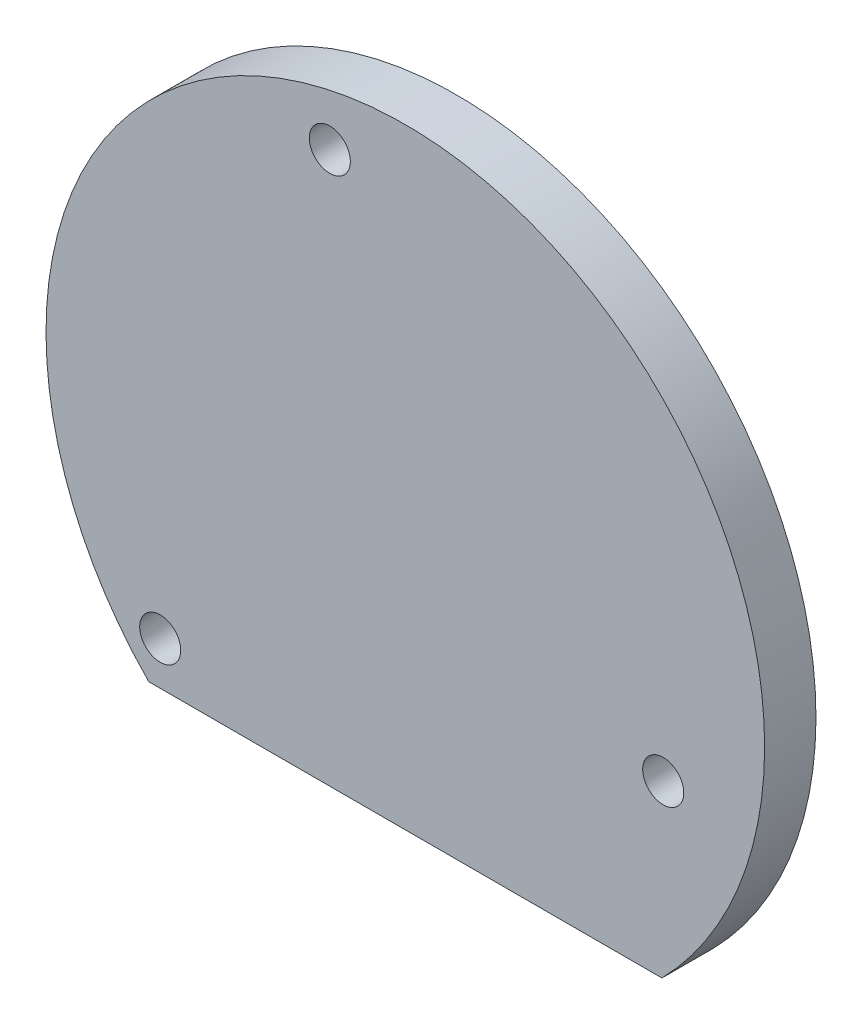
ISO-10303-21;
HEADER;
FILE_DESCRIPTION(('STEP AP214'),'2;1');
FILE_NAME('part.step','',(''),(''),'','','');
FILE_SCHEMA(('AUTOMOTIVE_DESIGN { 1 0 10303 214 1 1 1 1 }'));
ENDSEC;
DATA;
#1=APPLICATION_CONTEXT('core data for automotive mechanical design processes');
#2=APPLICATION_PROTOCOL_DEFINITION('international standard','automotive_design',2000,#1);
#3=PRODUCT_CONTEXT('',#1,'mechanical');
#4=PRODUCT('Part','Part','',(#3));
#5=PRODUCT_RELATED_PRODUCT_CATEGORY('part','',(#4));
#6=PRODUCT_DEFINITION_FORMATION('','',#4);
#7=PRODUCT_DEFINITION_CONTEXT('part definition',#1,'design');
#8=PRODUCT_DEFINITION('design','',#6,#7);
#9=PRODUCT_DEFINITION_SHAPE('','',#8);
#10=(LENGTH_UNIT() NAMED_UNIT(*) SI_UNIT(.MILLI.,.METRE.));
#11=(NAMED_UNIT(*) PLANE_ANGLE_UNIT() SI_UNIT($,.RADIAN.));
#12=(NAMED_UNIT(*) SI_UNIT($,.STERADIAN.) SOLID_ANGLE_UNIT());
#13=UNCERTAINTY_MEASURE_WITH_UNIT(LENGTH_MEASURE(1.E-05),#10,'distance_accuracy_value','');
#14=(GEOMETRIC_REPRESENTATION_CONTEXT(3) GLOBAL_UNCERTAINTY_ASSIGNED_CONTEXT((#13)) GLOBAL_UNIT_ASSIGNED_CONTEXT((#10,
#11,#12)) REPRESENTATION_CONTEXT('',''));
#15=CARTESIAN_POINT('',(0.,0.,0.));
#16=DIRECTION('',(0.,0.,1.));
#17=DIRECTION('',(1.,0.,0.));
#18=AXIS2_PLACEMENT_3D('',#15,#16,#17);
#19=CARTESIAN_POINT('',(0.,0.,5.08));
#20=DIRECTION('',(0.,0.,-1.));
#21=DIRECTION('',(-1.,0.,0.));
#22=AXIS2_PLACEMENT_3D('',#19,#20,#21);
#23=CYLINDRICAL_SURFACE('',#22,35.56);
#24=CARTESIAN_POINT('',(0.,0.,5.08));
#25=DIRECTION('',(0.,0.,1.));
#26=DIRECTION('',(1.,0.,0.));
#27=AXIS2_PLACEMENT_3D('',#24,#25,#26);
#28=CIRCLE('',#27,35.56);
#29=CARTESIAN_POINT('',(25.3949194918984,-24.892,5.08));
#30=VERTEX_POINT('',#29);
#31=CARTESIAN_POINT('',(-25.3949194918984,-24.892,5.08));
#32=VERTEX_POINT('',#31);
#33=EDGE_CURVE('E39',#30,#32,#28,.T.);
#34=ORIENTED_EDGE('',*,*,#33,.F.);
#35=DIRECTION('',(0.,0.,-1.));
#36=VECTOR('',#35,1.);
#37=CARTESIAN_POINT('',(25.3949194918984,-24.892,5.08));
#38=LINE('',#37,#36);
#39=CARTESIAN_POINT('',(25.3949194918984,-24.892,0.));
#40=VERTEX_POINT('',#39);
#41=EDGE_CURVE('E53',#30,#40,#38,.T.);
#42=ORIENTED_EDGE('',*,*,#41,.T.);
#43=CARTESIAN_POINT('',(0.,0.,0.));
#44=DIRECTION('',(0.,0.,1.));
#45=DIRECTION('',(1.,0.,0.));
#46=AXIS2_PLACEMENT_3D('',#43,#44,#45);
#47=CIRCLE('',#46,35.56);
#48=CARTESIAN_POINT('',(-25.3949194918984,-24.892,0.));
#49=VERTEX_POINT('',#48);
#50=EDGE_CURVE('E61',#40,#49,#47,.T.);
#51=ORIENTED_EDGE('',*,*,#50,.T.);
#52=DIRECTION('',(0.,0.,-1.));
#53=VECTOR('',#52,1.);
#54=CARTESIAN_POINT('',(-25.3949194918984,-24.892,5.08));
#55=LINE('',#54,#53);
#56=EDGE_CURVE('E46',#49,#32,#55,.F.);
#57=ORIENTED_EDGE('',*,*,#56,.T.);
#58=EDGE_LOOP('',(#34,#42,#51,#57));
#59=FACE_BOUND('',#58,.T.);
#60=ADVANCED_FACE('F32',(#59),#23,.T.);
#61=CARTESIAN_POINT('',(0.,0.,5.08));
#62=DIRECTION('',(0.,0.,1.));
#63=DIRECTION('',(1.,0.,0.));
#64=AXIS2_PLACEMENT_3D('',#61,#62,#63);
#65=PLANE('',#64);
#66=CARTESIAN_POINT('',(-24.2610998869317,-20.6264765028923,5.08));
#67=DIRECTION('',(0.,0.,1.));
#68=DIRECTION('',(1.,0.,0.));
#69=AXIS2_PLACEMENT_3D('',#66,#67,#68);
#70=CIRCLE('',#69,2.032);
#71=CARTESIAN_POINT('',(-22.2290998869317,-20.6264765028923,5.08));
#72=VERTEX_POINT('',#71);
#73=EDGE_CURVE('E83',#72,#72,#70,.T.);
#74=ORIENTED_EDGE('',*,*,#73,.F.);
#75=EDGE_LOOP('',(#74));
#76=FACE_BOUND('',#75,.T.);
#77=CARTESIAN_POINT('',(-7.47196911393405,29.6655234971077,5.08));
#78=DIRECTION('',(0.,0.,1.));
#79=DIRECTION('',(1.,0.,0.));
#80=AXIS2_PLACEMENT_3D('',#77,#78,#79);
#81=CIRCLE('',#80,2.032);
#82=CARTESIAN_POINT('',(-5.43996911393405,29.6655234971077,5.08));
#83=VERTEX_POINT('',#82);
#84=EDGE_CURVE('E77',#83,#83,#81,.T.);
#85=ORIENTED_EDGE('',*,*,#84,.F.);
#86=EDGE_LOOP('',(#85));
#87=FACE_BOUND('',#86,.T.);
#88=CARTESIAN_POINT('',(25.5229001130683,-7.95282373789202,5.08));
#89=DIRECTION('',(0.,0.,1.));
#90=DIRECTION('',(1.,0.,0.));
#91=AXIS2_PLACEMENT_3D('',#88,#89,#90);
#92=CIRCLE('',#91,2.032);
#93=CARTESIAN_POINT('',(27.5549001130683,-7.95282373789202,5.08));
#94=VERTEX_POINT('',#93);
#95=EDGE_CURVE('E71',#94,#94,#92,.T.);
#96=ORIENTED_EDGE('',*,*,#95,.F.);
#97=EDGE_LOOP('',(#96));
#98=FACE_BOUND('',#97,.T.);
#99=DIRECTION('',(-1.,0.,0.));
#100=VECTOR('',#99,1.);
#101=CARTESIAN_POINT('',(-36.2560555223226,-24.892,5.08));
#102=LINE('',#101,#100);
#103=EDGE_CURVE('E56',#30,#32,#102,.T.);
#104=ORIENTED_EDGE('',*,*,#103,.F.);
#105=ORIENTED_EDGE('',*,*,#33,.T.);
#106=EDGE_LOOP('',(#104,#105));
#107=FACE_BOUND('',#106,.T.);
#108=ADVANCED_FACE('F65',(#76,#87,#98,#107),#65,.T.);
#109=CARTESIAN_POINT('',(0.,0.,0.));
#110=DIRECTION('',(0.,0.,1.));
#111=DIRECTION('',(1.,0.,0.));
#112=AXIS2_PLACEMENT_3D('',#109,#110,#111);
#113=PLANE('',#112);
#114=CARTESIAN_POINT('',(-24.2610998869317,-20.6264765028923,0.));
#115=DIRECTION('',(0.,0.,1.));
#116=DIRECTION('',(1.,0.,0.));
#117=AXIS2_PLACEMENT_3D('',#114,#115,#116);
#118=CIRCLE('',#117,2.032);
#119=CARTESIAN_POINT('',(-22.2290998869317,-20.6264765028923,0.));
#120=VERTEX_POINT('',#119);
#121=EDGE_CURVE('E66',#120,#120,#118,.T.);
#122=ORIENTED_EDGE('',*,*,#121,.T.);
#123=EDGE_LOOP('',(#122));
#124=FACE_BOUND('',#123,.T.);
#125=CARTESIAN_POINT('',(-7.47196911393405,29.6655234971077,0.));
#126=DIRECTION('',(0.,0.,1.));
#127=DIRECTION('',(1.,0.,0.));
#128=AXIS2_PLACEMENT_3D('',#125,#126,#127);
#129=CIRCLE('',#128,2.032);
#130=CARTESIAN_POINT('',(-5.43996911393405,29.6655234971077,0.));
#131=VERTEX_POINT('',#130);
#132=EDGE_CURVE('E80',#131,#131,#129,.T.);
#133=ORIENTED_EDGE('',*,*,#132,.T.);
#134=EDGE_LOOP('',(#133));
#135=FACE_BOUND('',#134,.T.);
#136=CARTESIAN_POINT('',(25.5229001130683,-7.95282373789202,0.));
#137=DIRECTION('',(0.,0.,1.));
#138=DIRECTION('',(1.,0.,0.));
#139=AXIS2_PLACEMENT_3D('',#136,#137,#138);
#140=CIRCLE('',#139,2.032);
#141=CARTESIAN_POINT('',(27.5549001130683,-7.95282373789202,0.));
#142=VERTEX_POINT('',#141);
#143=EDGE_CURVE('E74',#142,#142,#140,.T.);
#144=ORIENTED_EDGE('',*,*,#143,.T.);
#145=EDGE_LOOP('',(#144));
#146=FACE_BOUND('',#145,.T.);
#147=ORIENTED_EDGE('',*,*,#50,.F.);
#148=DIRECTION('',(-1.,0.,0.));
#149=VECTOR('',#148,1.);
#150=CARTESIAN_POINT('',(0.,-24.892,0.));
#151=LINE('',#150,#149);
#152=EDGE_CURVE('E11',#40,#49,#151,.T.);
#153=ORIENTED_EDGE('',*,*,#152,.T.);
#154=EDGE_LOOP('',(#147,#153));
#155=FACE_BOUND('',#154,.T.);
#156=ADVANCED_FACE('F89',(#124,#135,#146,#155),#113,.F.);
#157=CARTESIAN_POINT('',(-36.2560555223226,-24.892,0.));
#158=DIRECTION('',(0.,1.,0.));
#159=DIRECTION('',(0.,0.,1.));
#160=AXIS2_PLACEMENT_3D('',#157,#158,#159);
#161=PLANE('',#160);
#162=ORIENTED_EDGE('',*,*,#103,.T.);
#163=ORIENTED_EDGE('',*,*,#56,.F.);
#164=ORIENTED_EDGE('',*,*,#152,.F.);
#165=ORIENTED_EDGE('',*,*,#41,.F.);
#166=EDGE_LOOP('',(#162,#163,#164,#165));
#167=FACE_BOUND('',#166,.T.);
#168=ADVANCED_FACE('F55',(#167),#161,.F.);
#169=CARTESIAN_POINT('',(25.5229001130683,-7.95282373789202,0.));
#170=DIRECTION('',(0.,0.,1.));
#171=DIRECTION('',(1.,0.,0.));
#172=AXIS2_PLACEMENT_3D('',#169,#170,#171);
#173=CYLINDRICAL_SURFACE('',#172,2.032);
#174=ORIENTED_EDGE('',*,*,#143,.F.);
#175=EDGE_LOOP('',(#174));
#176=FACE_BOUND('',#175,.T.);
#177=ORIENTED_EDGE('',*,*,#95,.T.);
#178=EDGE_LOOP('',(#177));
#179=FACE_BOUND('',#178,.T.);
#180=ADVANCED_FACE('F106',(#176,#179),#173,.F.);
#181=CARTESIAN_POINT('',(-7.47196911393405,29.6655234971077,0.));
#182=DIRECTION('',(0.,0.,1.));
#183=DIRECTION('',(1.,0.,0.));
#184=AXIS2_PLACEMENT_3D('',#181,#182,#183);
#185=CYLINDRICAL_SURFACE('',#184,2.032);
#186=ORIENTED_EDGE('',*,*,#132,.F.);
#187=EDGE_LOOP('',(#186));
#188=FACE_BOUND('',#187,.T.);
#189=ORIENTED_EDGE('',*,*,#84,.T.);
#190=EDGE_LOOP('',(#189));
#191=FACE_BOUND('',#190,.T.);
#192=ADVANCED_FACE('F95',(#188,#191),#185,.F.);
#193=CARTESIAN_POINT('',(-24.2610998869317,-20.6264765028923,0.));
#194=DIRECTION('',(0.,0.,1.));
#195=DIRECTION('',(1.,0.,0.));
#196=AXIS2_PLACEMENT_3D('',#193,#194,#195);
#197=CYLINDRICAL_SURFACE('',#196,2.032);
#198=ORIENTED_EDGE('',*,*,#121,.F.);
#199=EDGE_LOOP('',(#198));
#200=FACE_BOUND('',#199,.T.);
#201=ORIENTED_EDGE('',*,*,#73,.T.);
#202=EDGE_LOOP('',(#201));
#203=FACE_BOUND('',#202,.T.);
#204=ADVANCED_FACE('F92',(#200,#203),#197,.F.);
#205=CLOSED_SHELL('',(#60,#108,#156,#168,#180,#192,#204));
#206=MANIFOLD_SOLID_BREP('B2',#205);
#207=ADVANCED_BREP_SHAPE_REPRESENTATION('',(#18,#206),#14);
#208=SHAPE_DEFINITION_REPRESENTATION(#9,#207);
ENDSEC;
END-ISO-10303-21;
